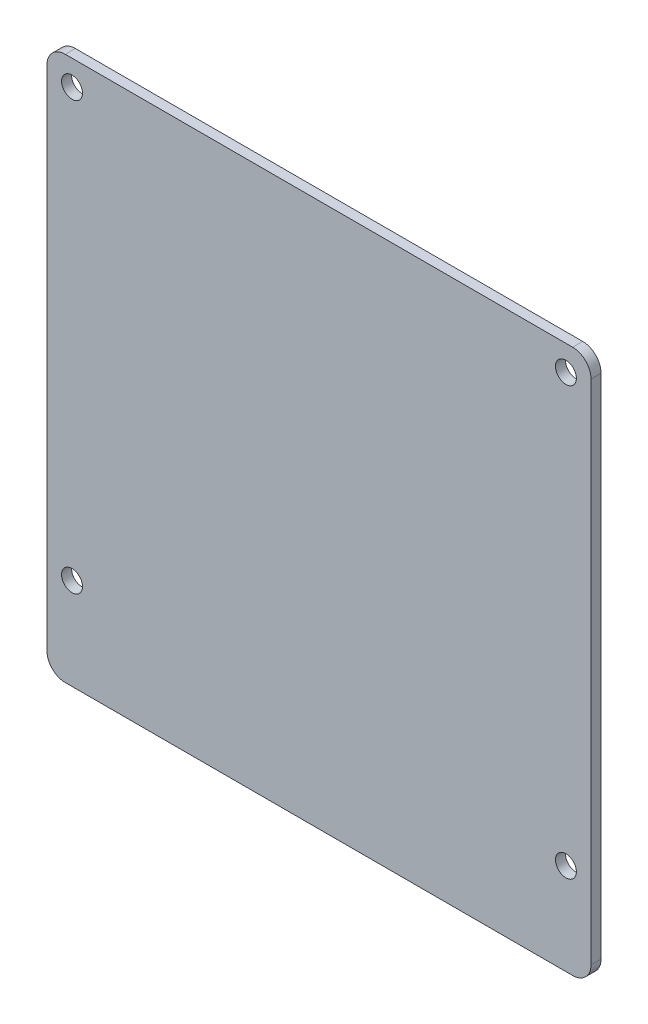
ISO-10303-21;
HEADER;
FILE_DESCRIPTION(('STEP AP214'),'2;1');
FILE_NAME('part.step','',(''),(''),'','','');
FILE_SCHEMA(('AUTOMOTIVE_DESIGN { 1 0 10303 214 1 1 1 1 }'));
ENDSEC;
DATA;
#1=APPLICATION_CONTEXT('core data for automotive mechanical design processes');
#2=APPLICATION_PROTOCOL_DEFINITION('international standard','automotive_design',2000,#1);
#3=PRODUCT_CONTEXT('',#1,'mechanical');
#4=PRODUCT('Part','Part','',(#3));
#5=PRODUCT_RELATED_PRODUCT_CATEGORY('part','',(#4));
#6=PRODUCT_DEFINITION_FORMATION('','',#4);
#7=PRODUCT_DEFINITION_CONTEXT('part definition',#1,'design');
#8=PRODUCT_DEFINITION('design','',#6,#7);
#9=PRODUCT_DEFINITION_SHAPE('','',#8);
#10=(LENGTH_UNIT() NAMED_UNIT(*) SI_UNIT(.MILLI.,.METRE.));
#11=(NAMED_UNIT(*) PLANE_ANGLE_UNIT() SI_UNIT($,.RADIAN.));
#12=(NAMED_UNIT(*) SI_UNIT($,.STERADIAN.) SOLID_ANGLE_UNIT());
#13=UNCERTAINTY_MEASURE_WITH_UNIT(LENGTH_MEASURE(1.E-05),#10,'distance_accuracy_value','');
#14=(GEOMETRIC_REPRESENTATION_CONTEXT(3) GLOBAL_UNCERTAINTY_ASSIGNED_CONTEXT((#13)) GLOBAL_UNIT_ASSIGNED_CONTEXT((#10,
#11,#12)) REPRESENTATION_CONTEXT('',''));
#15=CARTESIAN_POINT('',(0.,0.,0.));
#16=DIRECTION('',(0.,0.,1.));
#17=DIRECTION('',(1.,0.,0.));
#18=AXIS2_PLACEMENT_3D('',#15,#16,#17);
#19=CARTESIAN_POINT('',(30.3,-30.3,1.2));
#20=DIRECTION('',(0.,0.,1.));
#21=DIRECTION('',(1.,0.,0.));
#22=AXIS2_PLACEMENT_3D('',#19,#20,#21);
#23=PLANE('',#22);
#24=CARTESIAN_POINT('',(29.5,-21.55,1.2));
#25=DIRECTION('',(0.,0.,1.));
#26=DIRECTION('',(1.,0.,0.));
#27=AXIS2_PLACEMENT_3D('',#24,#25,#26);
#28=CIRCLE('',#27,1.25);
#29=CARTESIAN_POINT('',(30.75,-21.55,1.2));
#30=VERTEX_POINT('',#29);
#31=EDGE_CURVE('E221',#30,#30,#28,.T.);
#32=ORIENTED_EDGE('',*,*,#31,.F.);
#33=EDGE_LOOP('',(#32));
#34=FACE_BOUND('',#33,.T.);
#35=CARTESIAN_POINT('',(-29.5,29.5,1.2));
#36=DIRECTION('',(0.,0.,1.));
#37=DIRECTION('',(1.,0.,0.));
#38=AXIS2_PLACEMENT_3D('',#35,#36,#37);
#39=CIRCLE('',#38,1.25);
#40=CARTESIAN_POINT('',(-28.25,29.5,1.2));
#41=VERTEX_POINT('',#40);
#42=EDGE_CURVE('E146',#41,#41,#39,.T.);
#43=ORIENTED_EDGE('',*,*,#42,.F.);
#44=EDGE_LOOP('',(#43));
#45=FACE_BOUND('',#44,.T.);
#46=CARTESIAN_POINT('',(30.3,-30.3,1.2));
#47=DIRECTION('',(0.,0.,1.));
#48=DIRECTION('',(1.,0.,0.));
#49=AXIS2_PLACEMENT_3D('',#46,#47,#48);
#50=CIRCLE('',#49,2.2);
#51=CARTESIAN_POINT('',(30.3,-32.5,1.2));
#52=VERTEX_POINT('',#51);
#53=CARTESIAN_POINT('',(32.5,-30.3,1.2));
#54=VERTEX_POINT('',#53);
#55=EDGE_CURVE('E164',#52,#54,#50,.T.);
#56=ORIENTED_EDGE('',*,*,#55,.T.);
#57=DIRECTION('',(0.,1.,0.));
#58=VECTOR('',#57,1.);
#59=CARTESIAN_POINT('',(32.5,30.3,1.2));
#60=LINE('',#59,#58);
#61=CARTESIAN_POINT('',(32.5,30.3,1.2));
#62=VERTEX_POINT('',#61);
#63=EDGE_CURVE('E100',#54,#62,#60,.T.);
#64=ORIENTED_EDGE('',*,*,#63,.T.);
#65=CARTESIAN_POINT('',(30.3,30.3,1.2));
#66=DIRECTION('',(0.,0.,1.));
#67=DIRECTION('',(-1.,0.,0.));
#68=AXIS2_PLACEMENT_3D('',#65,#66,#67);
#69=CIRCLE('',#68,2.2);
#70=CARTESIAN_POINT('',(30.3,32.5,1.2));
#71=VERTEX_POINT('',#70);
#72=EDGE_CURVE('E185',#62,#71,#69,.T.);
#73=ORIENTED_EDGE('',*,*,#72,.T.);
#74=DIRECTION('',(-1.,0.,0.));
#75=VECTOR('',#74,1.);
#76=CARTESIAN_POINT('',(-30.3,32.5,1.2));
#77=LINE('',#76,#75);
#78=CARTESIAN_POINT('',(-30.3,32.5,1.2));
#79=VERTEX_POINT('',#78);
#80=EDGE_CURVE('E199',#71,#79,#77,.T.);
#81=ORIENTED_EDGE('',*,*,#80,.T.);
#82=CARTESIAN_POINT('',(-30.3,30.3,1.2));
#83=DIRECTION('',(0.,0.,1.));
#84=DIRECTION('',(1.,0.,0.));
#85=AXIS2_PLACEMENT_3D('',#82,#83,#84);
#86=CIRCLE('',#85,2.2);
#87=CARTESIAN_POINT('',(-32.5,30.3,1.2));
#88=VERTEX_POINT('',#87);
#89=EDGE_CURVE('E119',#79,#88,#86,.T.);
#90=ORIENTED_EDGE('',*,*,#89,.T.);
#91=DIRECTION('',(0.,-1.,0.));
#92=VECTOR('',#91,1.);
#93=CARTESIAN_POINT('',(-32.5,30.3,1.2));
#94=LINE('',#93,#92);
#95=CARTESIAN_POINT('',(-32.5,-30.3,1.2));
#96=VERTEX_POINT('',#95);
#97=EDGE_CURVE('E113',#88,#96,#94,.T.);
#98=ORIENTED_EDGE('',*,*,#97,.T.);
#99=CARTESIAN_POINT('',(-30.3,-30.3,1.2));
#100=DIRECTION('',(0.,0.,1.));
#101=DIRECTION('',(1.,0.,0.));
#102=AXIS2_PLACEMENT_3D('',#99,#100,#101);
#103=CIRCLE('',#102,2.2);
#104=CARTESIAN_POINT('',(-30.3,-32.5,1.2));
#105=VERTEX_POINT('',#104);
#106=EDGE_CURVE('E117',#96,#105,#103,.T.);
#107=ORIENTED_EDGE('',*,*,#106,.T.);
#108=DIRECTION('',(1.,0.,0.));
#109=VECTOR('',#108,1.);
#110=CARTESIAN_POINT('',(-30.3,-32.5,1.2));
#111=LINE('',#110,#109);
#112=EDGE_CURVE('E57',#105,#52,#111,.T.);
#113=ORIENTED_EDGE('',*,*,#112,.T.);
#114=EDGE_LOOP('',(#56,#64,#73,#81,#90,#98,#107,#113));
#115=FACE_BOUND('',#114,.T.);
#116=CARTESIAN_POINT('',(-29.5,-21.55,1.2));
#117=DIRECTION('',(0.,0.,1.));
#118=DIRECTION('',(1.,0.,0.));
#119=AXIS2_PLACEMENT_3D('',#116,#117,#118);
#120=CIRCLE('',#119,1.25);
#121=CARTESIAN_POINT('',(-28.25,-21.55,1.2));
#122=VERTEX_POINT('',#121);
#123=EDGE_CURVE('E213',#122,#122,#120,.T.);
#124=ORIENTED_EDGE('',*,*,#123,.F.);
#125=EDGE_LOOP('',(#124));
#126=FACE_BOUND('',#125,.T.);
#127=CARTESIAN_POINT('',(29.5,29.5,1.2));
#128=DIRECTION('',(0.,0.,1.));
#129=DIRECTION('',(1.,0.,0.));
#130=AXIS2_PLACEMENT_3D('',#127,#128,#129);
#131=CIRCLE('',#130,1.25);
#132=CARTESIAN_POINT('',(30.75,29.5,1.2));
#133=VERTEX_POINT('',#132);
#134=EDGE_CURVE('E229',#133,#133,#131,.T.);
#135=ORIENTED_EDGE('',*,*,#134,.F.);
#136=EDGE_LOOP('',(#135));
#137=FACE_BOUND('',#136,.T.);
#138=ADVANCED_FACE('F39',(#34,#45,#115,#126,#137),#23,.T.);
#139=CARTESIAN_POINT('',(30.3,-30.3,0.));
#140=DIRECTION('',(0.,0.,1.));
#141=DIRECTION('',(1.,0.,0.));
#142=AXIS2_PLACEMENT_3D('',#139,#140,#141);
#143=PLANE('',#142);
#144=CARTESIAN_POINT('',(30.3,-30.3,0.));
#145=DIRECTION('',(0.,0.,1.));
#146=DIRECTION('',(1.,0.,0.));
#147=AXIS2_PLACEMENT_3D('',#144,#145,#146);
#148=CIRCLE('',#147,2.2);
#149=CARTESIAN_POINT('',(30.3,-32.5,0.));
#150=VERTEX_POINT('',#149);
#151=CARTESIAN_POINT('',(32.5,-30.3,0.));
#152=VERTEX_POINT('',#151);
#153=EDGE_CURVE('E141',#150,#152,#148,.T.);
#154=ORIENTED_EDGE('',*,*,#153,.F.);
#155=DIRECTION('',(1.,0.,0.));
#156=VECTOR('',#155,1.);
#157=CARTESIAN_POINT('',(-30.3,-32.5,0.));
#158=LINE('',#157,#156);
#159=CARTESIAN_POINT('',(-30.3,-32.5,0.));
#160=VERTEX_POINT('',#159);
#161=EDGE_CURVE('E92',#160,#150,#158,.T.);
#162=ORIENTED_EDGE('',*,*,#161,.F.);
#163=CARTESIAN_POINT('',(-30.3,-30.3,0.));
#164=DIRECTION('',(0.,0.,1.));
#165=DIRECTION('',(1.,0.,0.));
#166=AXIS2_PLACEMENT_3D('',#163,#164,#165);
#167=CIRCLE('',#166,2.2);
#168=CARTESIAN_POINT('',(-32.5,-30.3,0.));
#169=VERTEX_POINT('',#168);
#170=EDGE_CURVE('E86',#169,#160,#167,.T.);
#171=ORIENTED_EDGE('',*,*,#170,.F.);
#172=DIRECTION('',(0.,-1.,0.));
#173=VECTOR('',#172,1.);
#174=CARTESIAN_POINT('',(-32.5,30.3,0.));
#175=LINE('',#174,#173);
#176=CARTESIAN_POINT('',(-32.5,30.3,0.));
#177=VERTEX_POINT('',#176);
#178=EDGE_CURVE('E128',#177,#169,#175,.T.);
#179=ORIENTED_EDGE('',*,*,#178,.F.);
#180=CARTESIAN_POINT('',(-30.3,30.3,0.));
#181=DIRECTION('',(0.,0.,1.));
#182=DIRECTION('',(1.,0.,0.));
#183=AXIS2_PLACEMENT_3D('',#180,#181,#182);
#184=CIRCLE('',#183,2.2);
#185=CARTESIAN_POINT('',(-30.3,32.5,0.));
#186=VERTEX_POINT('',#185);
#187=EDGE_CURVE('E155',#186,#177,#184,.T.);
#188=ORIENTED_EDGE('',*,*,#187,.F.);
#189=DIRECTION('',(-1.,0.,0.));
#190=VECTOR('',#189,1.);
#191=CARTESIAN_POINT('',(-30.3,32.5,0.));
#192=LINE('',#191,#190);
#193=CARTESIAN_POINT('',(30.3,32.5,0.));
#194=VERTEX_POINT('',#193);
#195=EDGE_CURVE('E152',#194,#186,#192,.T.);
#196=ORIENTED_EDGE('',*,*,#195,.F.);
#197=CARTESIAN_POINT('',(30.3,30.3,0.));
#198=DIRECTION('',(0.,0.,1.));
#199=DIRECTION('',(-1.,0.,0.));
#200=AXIS2_PLACEMENT_3D('',#197,#198,#199);
#201=CIRCLE('',#200,2.2);
#202=CARTESIAN_POINT('',(32.5,30.3,0.));
#203=VERTEX_POINT('',#202);
#204=EDGE_CURVE('E149',#203,#194,#201,.T.);
#205=ORIENTED_EDGE('',*,*,#204,.F.);
#206=DIRECTION('',(0.,1.,0.));
#207=VECTOR('',#206,1.);
#208=CARTESIAN_POINT('',(32.5,30.3,0.));
#209=LINE('',#208,#207);
#210=EDGE_CURVE('E145',#152,#203,#209,.T.);
#211=ORIENTED_EDGE('',*,*,#210,.F.);
#212=EDGE_LOOP('',(#154,#162,#171,#179,#188,#196,#205,#211));
#213=FACE_BOUND('',#212,.T.);
#214=CARTESIAN_POINT('',(-29.5,29.5,0.));
#215=DIRECTION('',(0.,0.,1.));
#216=DIRECTION('',(1.,0.,0.));
#217=AXIS2_PLACEMENT_3D('',#214,#215,#216);
#218=CIRCLE('',#217,1.25);
#219=CARTESIAN_POINT('',(-28.25,29.5,0.));
#220=VERTEX_POINT('',#219);
#221=EDGE_CURVE('E209',#220,#220,#218,.T.);
#222=ORIENTED_EDGE('',*,*,#221,.T.);
#223=EDGE_LOOP('',(#222));
#224=FACE_BOUND('',#223,.T.);
#225=CARTESIAN_POINT('',(-29.5,-21.55,0.));
#226=DIRECTION('',(0.,0.,1.));
#227=DIRECTION('',(1.,0.,0.));
#228=AXIS2_PLACEMENT_3D('',#225,#226,#227);
#229=CIRCLE('',#228,1.25);
#230=CARTESIAN_POINT('',(-28.25,-21.55,0.));
#231=VERTEX_POINT('',#230);
#232=EDGE_CURVE('E217',#231,#231,#229,.T.);
#233=ORIENTED_EDGE('',*,*,#232,.T.);
#234=EDGE_LOOP('',(#233));
#235=FACE_BOUND('',#234,.T.);
#236=CARTESIAN_POINT('',(29.5,-21.55,0.));
#237=DIRECTION('',(0.,0.,1.));
#238=DIRECTION('',(1.,0.,0.));
#239=AXIS2_PLACEMENT_3D('',#236,#237,#238);
#240=CIRCLE('',#239,1.25);
#241=CARTESIAN_POINT('',(30.75,-21.55,0.));
#242=VERTEX_POINT('',#241);
#243=EDGE_CURVE('E225',#242,#242,#240,.T.);
#244=ORIENTED_EDGE('',*,*,#243,.T.);
#245=EDGE_LOOP('',(#244));
#246=FACE_BOUND('',#245,.T.);
#247=CARTESIAN_POINT('',(29.5,29.5,0.));
#248=DIRECTION('',(0.,0.,1.));
#249=DIRECTION('',(1.,0.,0.));
#250=AXIS2_PLACEMENT_3D('',#247,#248,#249);
#251=CIRCLE('',#250,1.25);
#252=CARTESIAN_POINT('',(30.75,29.5,0.));
#253=VERTEX_POINT('',#252);
#254=EDGE_CURVE('E233',#253,#253,#251,.T.);
#255=ORIENTED_EDGE('',*,*,#254,.T.);
#256=EDGE_LOOP('',(#255));
#257=FACE_BOUND('',#256,.T.);
#258=ADVANCED_FACE('F189',(#213,#224,#235,#246,#257),#143,.F.);
#259=CARTESIAN_POINT('',(30.3,-30.3,1.2));
#260=DIRECTION('',(0.,0.,-1.));
#261=DIRECTION('',(-1.,0.,0.));
#262=AXIS2_PLACEMENT_3D('',#259,#260,#261);
#263=CYLINDRICAL_SURFACE('',#262,2.2);
#264=ORIENTED_EDGE('',*,*,#153,.T.);
#265=DIRECTION('',(0.,0.,-1.));
#266=VECTOR('',#265,1.);
#267=CARTESIAN_POINT('',(32.5,-30.3,1.2));
#268=LINE('',#267,#266);
#269=EDGE_CURVE('E11',#54,#152,#268,.T.);
#270=ORIENTED_EDGE('',*,*,#269,.F.);
#271=ORIENTED_EDGE('',*,*,#55,.F.);
#272=DIRECTION('',(0.,0.,-1.));
#273=VECTOR('',#272,1.);
#274=CARTESIAN_POINT('',(30.3,-32.5,1.2));
#275=LINE('',#274,#273);
#276=EDGE_CURVE('E137',#52,#150,#275,.T.);
#277=ORIENTED_EDGE('',*,*,#276,.T.);
#278=EDGE_LOOP('',(#264,#270,#271,#277));
#279=FACE_BOUND('',#278,.T.);
#280=ADVANCED_FACE('F41',(#279),#263,.T.);
#281=CARTESIAN_POINT('',(32.5,30.3,1.2));
#282=DIRECTION('',(-1.,0.,0.));
#283=DIRECTION('',(0.,-1.,0.));
#284=AXIS2_PLACEMENT_3D('',#281,#282,#283);
#285=PLANE('',#284);
#286=ORIENTED_EDGE('',*,*,#210,.T.);
#287=DIRECTION('',(0.,0.,-1.));
#288=VECTOR('',#287,1.);
#289=CARTESIAN_POINT('',(32.5,30.3,1.2));
#290=LINE('',#289,#288);
#291=EDGE_CURVE('E49',#62,#203,#290,.T.);
#292=ORIENTED_EDGE('',*,*,#291,.F.);
#293=ORIENTED_EDGE('',*,*,#63,.F.);
#294=ORIENTED_EDGE('',*,*,#269,.T.);
#295=EDGE_LOOP('',(#286,#292,#293,#294));
#296=FACE_BOUND('',#295,.T.);
#297=ADVANCED_FACE('F269',(#296),#285,.F.);
#298=CARTESIAN_POINT('',(30.3,30.3,1.2));
#299=DIRECTION('',(0.,0.,-1.));
#300=DIRECTION('',(-1.,0.,0.));
#301=AXIS2_PLACEMENT_3D('',#298,#299,#300);
#302=CYLINDRICAL_SURFACE('',#301,2.2);
#303=ORIENTED_EDGE('',*,*,#204,.T.);
#304=DIRECTION('',(0.,0.,-1.));
#305=VECTOR('',#304,1.);
#306=CARTESIAN_POINT('',(30.3,32.5,1.2));
#307=LINE('',#306,#305);
#308=EDGE_CURVE('E175',#71,#194,#307,.T.);
#309=ORIENTED_EDGE('',*,*,#308,.F.);
#310=ORIENTED_EDGE('',*,*,#72,.F.);
#311=ORIENTED_EDGE('',*,*,#291,.T.);
#312=EDGE_LOOP('',(#303,#309,#310,#311));
#313=FACE_BOUND('',#312,.T.);
#314=ADVANCED_FACE('F183',(#313),#302,.T.);
#315=CARTESIAN_POINT('',(-30.3,32.5,1.2));
#316=DIRECTION('',(0.,-1.,0.));
#317=DIRECTION('',(0.,0.,-1.));
#318=AXIS2_PLACEMENT_3D('',#315,#316,#317);
#319=PLANE('',#318);
#320=ORIENTED_EDGE('',*,*,#195,.T.);
#321=DIRECTION('',(0.,0.,-1.));
#322=VECTOR('',#321,1.);
#323=CARTESIAN_POINT('',(-30.3,32.5,1.2));
#324=LINE('',#323,#322);
#325=EDGE_CURVE('E171',#79,#186,#324,.T.);
#326=ORIENTED_EDGE('',*,*,#325,.F.);
#327=ORIENTED_EDGE('',*,*,#80,.F.);
#328=ORIENTED_EDGE('',*,*,#308,.T.);
#329=EDGE_LOOP('',(#320,#326,#327,#328));
#330=FACE_BOUND('',#329,.T.);
#331=ADVANCED_FACE('F194',(#330),#319,.F.);
#332=CARTESIAN_POINT('',(-30.3,30.3,1.2));
#333=DIRECTION('',(0.,0.,-1.));
#334=DIRECTION('',(-1.,0.,0.));
#335=AXIS2_PLACEMENT_3D('',#332,#333,#334);
#336=CYLINDRICAL_SURFACE('',#335,2.2);
#337=ORIENTED_EDGE('',*,*,#187,.T.);
#338=DIRECTION('',(0.,0.,-1.));
#339=VECTOR('',#338,1.);
#340=CARTESIAN_POINT('',(-32.5,30.3,1.2));
#341=LINE('',#340,#339);
#342=EDGE_CURVE('E130',#88,#177,#341,.T.);
#343=ORIENTED_EDGE('',*,*,#342,.F.);
#344=ORIENTED_EDGE('',*,*,#89,.F.);
#345=ORIENTED_EDGE('',*,*,#325,.T.);
#346=EDGE_LOOP('',(#337,#343,#344,#345));
#347=FACE_BOUND('',#346,.T.);
#348=ADVANCED_FACE('F197',(#347),#336,.T.);
#349=CARTESIAN_POINT('',(-32.5,30.3,1.2));
#350=DIRECTION('',(1.,0.,0.));
#351=DIRECTION('',(0.,1.,0.));
#352=AXIS2_PLACEMENT_3D('',#349,#350,#351);
#353=PLANE('',#352);
#354=ORIENTED_EDGE('',*,*,#178,.T.);
#355=DIRECTION('',(0.,0.,-1.));
#356=VECTOR('',#355,1.);
#357=CARTESIAN_POINT('',(-32.5,-30.3,1.2));
#358=LINE('',#357,#356);
#359=EDGE_CURVE('E125',#96,#169,#358,.T.);
#360=ORIENTED_EDGE('',*,*,#359,.F.);
#361=ORIENTED_EDGE('',*,*,#97,.F.);
#362=ORIENTED_EDGE('',*,*,#342,.T.);
#363=EDGE_LOOP('',(#354,#360,#361,#362));
#364=FACE_BOUND('',#363,.T.);
#365=ADVANCED_FACE('F126',(#364),#353,.F.);
#366=CARTESIAN_POINT('',(-30.3,-30.3,1.2));
#367=DIRECTION('',(0.,0.,-1.));
#368=DIRECTION('',(-1.,0.,0.));
#369=AXIS2_PLACEMENT_3D('',#366,#367,#368);
#370=CYLINDRICAL_SURFACE('',#369,2.2);
#371=ORIENTED_EDGE('',*,*,#170,.T.);
#372=DIRECTION('',(0.,0.,-1.));
#373=VECTOR('',#372,1.);
#374=CARTESIAN_POINT('',(-30.3,-32.5,1.2));
#375=LINE('',#374,#373);
#376=EDGE_CURVE('E131',#105,#160,#375,.T.);
#377=ORIENTED_EDGE('',*,*,#376,.F.);
#378=ORIENTED_EDGE('',*,*,#106,.F.);
#379=ORIENTED_EDGE('',*,*,#359,.T.);
#380=EDGE_LOOP('',(#371,#377,#378,#379));
#381=FACE_BOUND('',#380,.T.);
#382=ADVANCED_FACE('F133',(#381),#370,.T.);
#383=CARTESIAN_POINT('',(-30.3,-32.5,1.2));
#384=DIRECTION('',(0.,1.,0.));
#385=DIRECTION('',(0.,0.,1.));
#386=AXIS2_PLACEMENT_3D('',#383,#384,#385);
#387=PLANE('',#386);
#388=ORIENTED_EDGE('',*,*,#161,.T.);
#389=ORIENTED_EDGE('',*,*,#276,.F.);
#390=ORIENTED_EDGE('',*,*,#112,.F.);
#391=ORIENTED_EDGE('',*,*,#376,.T.);
#392=EDGE_LOOP('',(#388,#389,#390,#391));
#393=FACE_BOUND('',#392,.T.);
#394=ADVANCED_FACE('F257',(#393),#387,.F.);
#395=CARTESIAN_POINT('',(-29.5,29.5,1.2));
#396=DIRECTION('',(0.,0.,-1.));
#397=DIRECTION('',(-1.,0.,0.));
#398=AXIS2_PLACEMENT_3D('',#395,#396,#397);
#399=CYLINDRICAL_SURFACE('',#398,1.25);
#400=ORIENTED_EDGE('',*,*,#42,.T.);
#401=EDGE_LOOP('',(#400));
#402=FACE_BOUND('',#401,.T.);
#403=ORIENTED_EDGE('',*,*,#221,.F.);
#404=EDGE_LOOP('',(#403));
#405=FACE_BOUND('',#404,.T.);
#406=ADVANCED_FACE('F254',(#402,#405),#399,.F.);
#407=CARTESIAN_POINT('',(-29.5,-21.55,1.2));
#408=DIRECTION('',(0.,0.,-1.));
#409=DIRECTION('',(-1.,0.,0.));
#410=AXIS2_PLACEMENT_3D('',#407,#408,#409);
#411=CYLINDRICAL_SURFACE('',#410,1.25);
#412=ORIENTED_EDGE('',*,*,#123,.T.);
#413=EDGE_LOOP('',(#412));
#414=FACE_BOUND('',#413,.T.);
#415=ORIENTED_EDGE('',*,*,#232,.F.);
#416=EDGE_LOOP('',(#415));
#417=FACE_BOUND('',#416,.T.);
#418=ADVANCED_FACE('F333',(#414,#417),#411,.F.);
#419=CARTESIAN_POINT('',(29.5,-21.55,1.2));
#420=DIRECTION('',(0.,0.,-1.));
#421=DIRECTION('',(-1.,0.,0.));
#422=AXIS2_PLACEMENT_3D('',#419,#420,#421);
#423=CYLINDRICAL_SURFACE('',#422,1.25);
#424=ORIENTED_EDGE('',*,*,#31,.T.);
#425=EDGE_LOOP('',(#424));
#426=FACE_BOUND('',#425,.T.);
#427=ORIENTED_EDGE('',*,*,#243,.F.);
#428=EDGE_LOOP('',(#427));
#429=FACE_BOUND('',#428,.T.);
#430=ADVANCED_FACE('F341',(#426,#429),#423,.F.);
#431=CARTESIAN_POINT('',(29.5,29.5,1.2));
#432=DIRECTION('',(0.,0.,-1.));
#433=DIRECTION('',(-1.,0.,0.));
#434=AXIS2_PLACEMENT_3D('',#431,#432,#433);
#435=CYLINDRICAL_SURFACE('',#434,1.25);
#436=ORIENTED_EDGE('',*,*,#134,.T.);
#437=EDGE_LOOP('',(#436));
#438=FACE_BOUND('',#437,.T.);
#439=ORIENTED_EDGE('',*,*,#254,.F.);
#440=EDGE_LOOP('',(#439));
#441=FACE_BOUND('',#440,.T.);
#442=ADVANCED_FACE('F241',(#438,#441),#435,.F.);
#443=CLOSED_SHELL('',(#138,#258,#280,#297,#314,#331,#348,#365,#382,#394,#406,#418,#430,#442));
#444=MANIFOLD_SOLID_BREP('B2',#443);
#445=ADVANCED_BREP_SHAPE_REPRESENTATION('',(#18,#444),#14);
#446=SHAPE_DEFINITION_REPRESENTATION(#9,#445);
ENDSEC;
END-ISO-10303-21;
